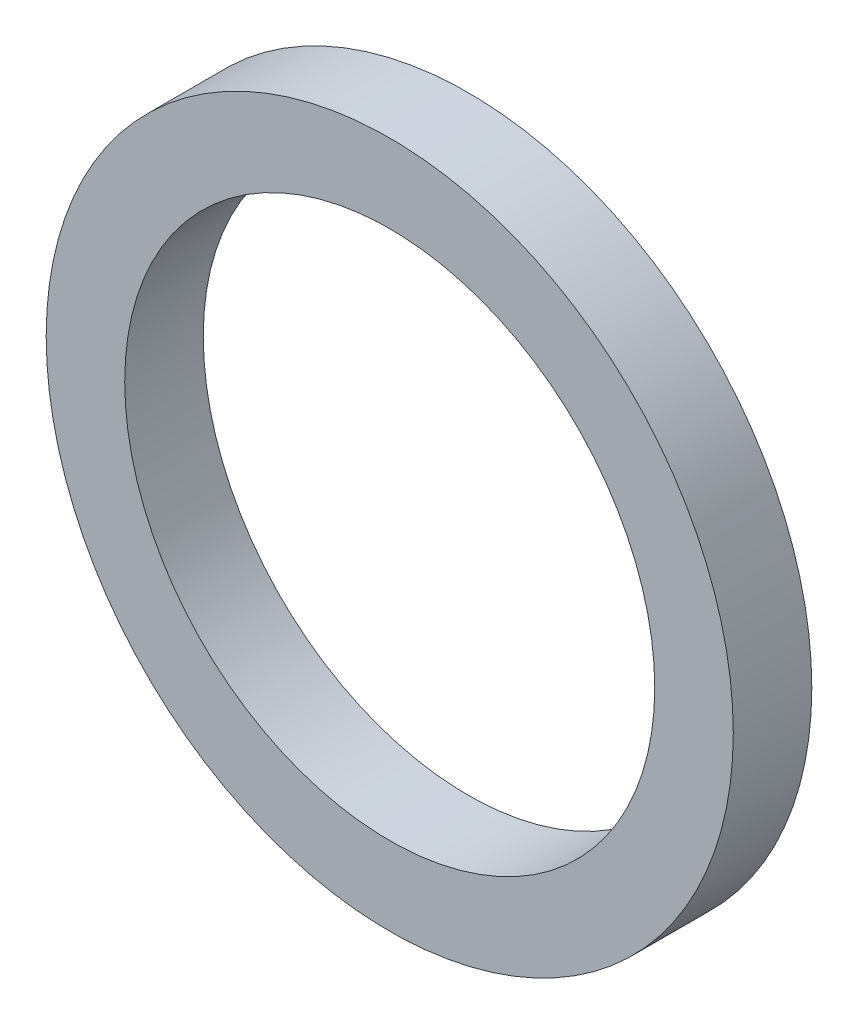
ISO-10303-21;
HEADER;
FILE_DESCRIPTION(('STEP AP214'),'2;1');
FILE_NAME('part.step','',(''),(''),'','','');
FILE_SCHEMA(('AUTOMOTIVE_DESIGN { 1 0 10303 214 1 1 1 1 }'));
ENDSEC;
DATA;
#1=APPLICATION_CONTEXT('core data for automotive mechanical design processes');
#2=APPLICATION_PROTOCOL_DEFINITION('international standard','automotive_design',2000,#1);
#3=PRODUCT_CONTEXT('',#1,'mechanical');
#4=PRODUCT('Part','Part','',(#3));
#5=PRODUCT_RELATED_PRODUCT_CATEGORY('part','',(#4));
#6=PRODUCT_DEFINITION_FORMATION('','',#4);
#7=PRODUCT_DEFINITION_CONTEXT('part definition',#1,'design');
#8=PRODUCT_DEFINITION('design','',#6,#7);
#9=PRODUCT_DEFINITION_SHAPE('','',#8);
#10=(LENGTH_UNIT() NAMED_UNIT(*) SI_UNIT(.MILLI.,.METRE.));
#11=(NAMED_UNIT(*) PLANE_ANGLE_UNIT() SI_UNIT($,.RADIAN.));
#12=(NAMED_UNIT(*) SI_UNIT($,.STERADIAN.) SOLID_ANGLE_UNIT());
#13=UNCERTAINTY_MEASURE_WITH_UNIT(LENGTH_MEASURE(1.E-05),#10,'distance_accuracy_value','');
#14=(GEOMETRIC_REPRESENTATION_CONTEXT(3) GLOBAL_UNCERTAINTY_ASSIGNED_CONTEXT((#13)) GLOBAL_UNIT_ASSIGNED_CONTEXT((#10,
#11,#12)) REPRESENTATION_CONTEXT('',''));
#15=CARTESIAN_POINT('',(0.,0.,0.));
#16=DIRECTION('',(0.,0.,1.));
#17=DIRECTION('',(1.,0.,0.));
#18=AXIS2_PLACEMENT_3D('',#15,#16,#17);
#19=CARTESIAN_POINT('',(0.,0.,1.6));
#20=DIRECTION('',(0.,0.,1.));
#21=DIRECTION('',(1.,0.,0.));
#22=AXIS2_PLACEMENT_3D('',#19,#20,#21);
#23=PLANE('',#22);
#24=CARTESIAN_POINT('',(0.,0.,1.6));
#25=DIRECTION('',(0.,0.,1.));
#26=DIRECTION('',(1.,0.,0.));
#27=AXIS2_PLACEMENT_3D('',#24,#25,#26);
#28=CIRCLE('',#27,7.);
#29=CARTESIAN_POINT('',(7.,0.,1.6));
#30=VERTEX_POINT('',#29);
#31=EDGE_CURVE('E10',#30,#30,#28,.T.);
#32=ORIENTED_EDGE('',*,*,#31,.T.);
#33=EDGE_LOOP('',(#32));
#34=FACE_BOUND('',#33,.T.);
#35=CARTESIAN_POINT('',(0.,0.,1.6));
#36=DIRECTION('',(0.,0.,1.));
#37=DIRECTION('',(1.,0.,0.));
#38=AXIS2_PLACEMENT_3D('',#35,#36,#37);
#39=CIRCLE('',#38,5.4);
#40=CARTESIAN_POINT('',(5.4,0.,1.6));
#41=VERTEX_POINT('',#40);
#42=EDGE_CURVE('E50',#41,#41,#39,.T.);
#43=ORIENTED_EDGE('',*,*,#42,.F.);
#44=EDGE_LOOP('',(#43));
#45=FACE_BOUND('',#44,.T.);
#46=ADVANCED_FACE('F37',(#34,#45),#23,.T.);
#47=CARTESIAN_POINT('',(0.,0.,0.));
#48=DIRECTION('',(0.,0.,1.));
#49=DIRECTION('',(1.,0.,0.));
#50=AXIS2_PLACEMENT_3D('',#47,#48,#49);
#51=PLANE('',#50);
#52=CARTESIAN_POINT('',(0.,0.,0.));
#53=DIRECTION('',(0.,0.,1.));
#54=DIRECTION('',(1.,0.,0.));
#55=AXIS2_PLACEMENT_3D('',#52,#53,#54);
#56=CIRCLE('',#55,7.);
#57=CARTESIAN_POINT('',(7.,0.,0.));
#58=VERTEX_POINT('',#57);
#59=EDGE_CURVE('E41',#58,#58,#56,.T.);
#60=ORIENTED_EDGE('',*,*,#59,.F.);
#61=EDGE_LOOP('',(#60));
#62=FACE_BOUND('',#61,.T.);
#63=CARTESIAN_POINT('',(0.,0.,0.));
#64=DIRECTION('',(0.,0.,1.));
#65=DIRECTION('',(1.,0.,0.));
#66=AXIS2_PLACEMENT_3D('',#63,#64,#65);
#67=CIRCLE('',#66,5.4);
#68=CARTESIAN_POINT('',(5.4,0.,0.));
#69=VERTEX_POINT('',#68);
#70=EDGE_CURVE('E52',#69,#69,#67,.T.);
#71=ORIENTED_EDGE('',*,*,#70,.T.);
#72=EDGE_LOOP('',(#71));
#73=FACE_BOUND('',#72,.T.);
#74=ADVANCED_FACE('F64',(#62,#73),#51,.F.);
#75=CARTESIAN_POINT('',(0.,0.,1.6));
#76=DIRECTION('',(0.,0.,-1.));
#77=DIRECTION('',(-1.,0.,0.));
#78=AXIS2_PLACEMENT_3D('',#75,#76,#77);
#79=CYLINDRICAL_SURFACE('',#78,7.);
#80=ORIENTED_EDGE('',*,*,#31,.F.);
#81=EDGE_LOOP('',(#80));
#82=FACE_BOUND('',#81,.T.);
#83=ORIENTED_EDGE('',*,*,#59,.T.);
#84=EDGE_LOOP('',(#83));
#85=FACE_BOUND('',#84,.T.);
#86=ADVANCED_FACE('F39',(#82,#85),#79,.T.);
#87=CARTESIAN_POINT('',(0.,0.,1.6));
#88=DIRECTION('',(0.,0.,-1.));
#89=DIRECTION('',(-1.,0.,0.));
#90=AXIS2_PLACEMENT_3D('',#87,#88,#89);
#91=CYLINDRICAL_SURFACE('',#90,5.4);
#92=ORIENTED_EDGE('',*,*,#42,.T.);
#93=EDGE_LOOP('',(#92));
#94=FACE_BOUND('',#93,.T.);
#95=ORIENTED_EDGE('',*,*,#70,.F.);
#96=EDGE_LOOP('',(#95));
#97=FACE_BOUND('',#96,.T.);
#98=ADVANCED_FACE('F60',(#94,#97),#91,.F.);
#99=CLOSED_SHELL('',(#46,#74,#86,#98));
#100=MANIFOLD_SOLID_BREP('B2',#99);
#101=ADVANCED_BREP_SHAPE_REPRESENTATION('',(#18,#100),#14);
#102=SHAPE_DEFINITION_REPRESENTATION(#9,#101);
ENDSEC;
END-ISO-10303-21;
